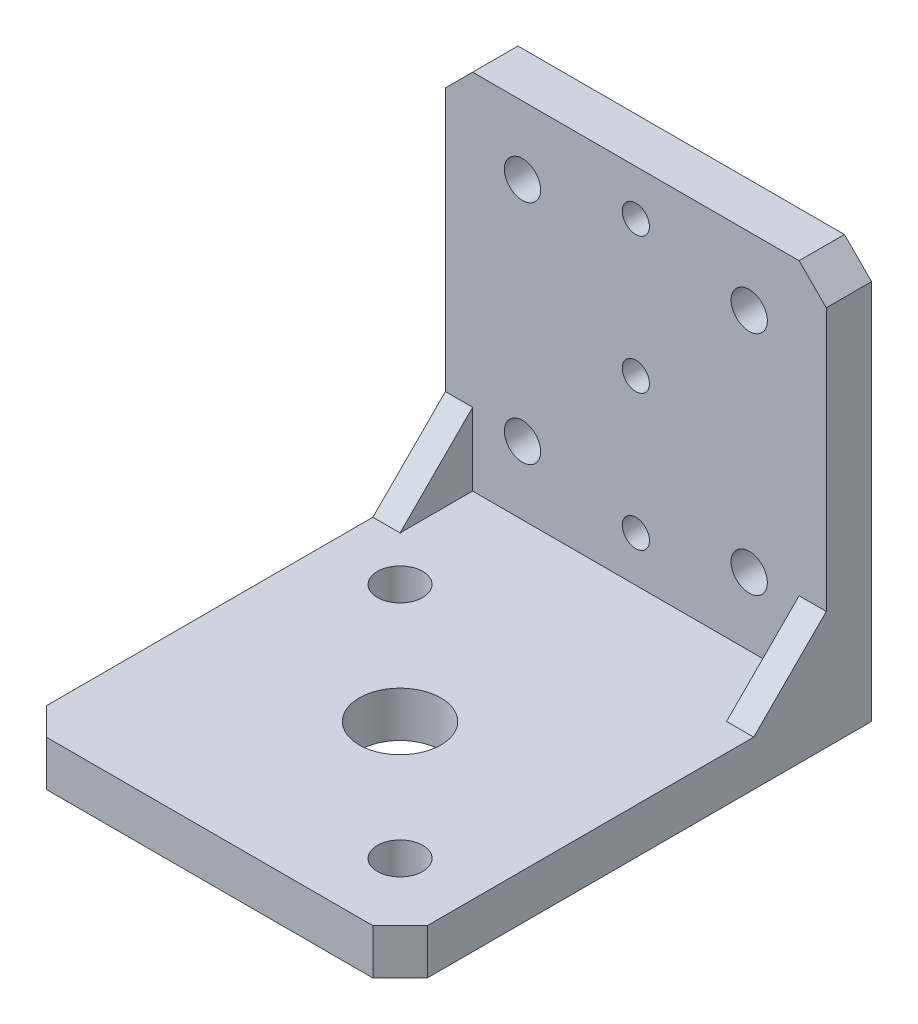
ISO-10303-21;
HEADER;
FILE_DESCRIPTION(('STEP AP214'),'2;1');
FILE_NAME('part.step','',(''),(''),'','','');
FILE_SCHEMA(('AUTOMOTIVE_DESIGN { 1 0 10303 214 1 1 1 1 }'));
ENDSEC;
DATA;
#1=APPLICATION_CONTEXT('core data for automotive mechanical design processes');
#2=APPLICATION_PROTOCOL_DEFINITION('international standard','automotive_design',2000,#1);
#3=PRODUCT_CONTEXT('',#1,'mechanical');
#4=PRODUCT('Part','Part','',(#3));
#5=PRODUCT_RELATED_PRODUCT_CATEGORY('part','',(#4));
#6=PRODUCT_DEFINITION_FORMATION('','',#4);
#7=PRODUCT_DEFINITION_CONTEXT('part definition',#1,'design');
#8=PRODUCT_DEFINITION('design','',#6,#7);
#9=PRODUCT_DEFINITION_SHAPE('','',#8);
#10=(LENGTH_UNIT() NAMED_UNIT(*) SI_UNIT(.MILLI.,.METRE.));
#11=(NAMED_UNIT(*) PLANE_ANGLE_UNIT() SI_UNIT($,.RADIAN.));
#12=(NAMED_UNIT(*) SI_UNIT($,.STERADIAN.) SOLID_ANGLE_UNIT());
#13=UNCERTAINTY_MEASURE_WITH_UNIT(LENGTH_MEASURE(1.E-05),#10,'distance_accuracy_value','');
#14=(GEOMETRIC_REPRESENTATION_CONTEXT(3) GLOBAL_UNCERTAINTY_ASSIGNED_CONTEXT((#13)) GLOBAL_UNIT_ASSIGNED_CONTEXT((#10,
#11,#12)) REPRESENTATION_CONTEXT('',''));
#15=CARTESIAN_POINT('',(0.,0.,0.));
#16=DIRECTION('',(0.,0.,1.));
#17=DIRECTION('',(1.,0.,0.));
#18=AXIS2_PLACEMENT_3D('',#15,#16,#17);
#19=CARTESIAN_POINT('',(21.,5.,23.5));
#20=DIRECTION('',(-1.,0.,0.));
#21=DIRECTION('',(0.,0.,1.));
#22=AXIS2_PLACEMENT_3D('',#19,#20,#21);
#23=PLANE('',#22);
#24=DIRECTION('',(0.,0.,-1.));
#25=VECTOR('',#24,1.);
#26=CARTESIAN_POINT('',(21.,5.,23.5));
#27=LINE('',#26,#25);
#28=CARTESIAN_POINT('',(21.,5.,20.5));
#29=VERTEX_POINT('',#28);
#30=CARTESIAN_POINT('',(21.,5.,-15.5));
#31=VERTEX_POINT('',#30);
#32=EDGE_CURVE('E163',#29,#31,#27,.T.);
#33=ORIENTED_EDGE('',*,*,#32,.F.);
#34=DIRECTION('',(0.,-1.,0.));
#35=VECTOR('',#34,1.);
#36=CARTESIAN_POINT('',(21.,5.,20.5));
#37=LINE('',#36,#35);
#38=CARTESIAN_POINT('',(21.,0.,20.5));
#39=VERTEX_POINT('',#38);
#40=EDGE_CURVE('E334',#29,#39,#37,.T.);
#41=ORIENTED_EDGE('',*,*,#40,.T.);
#42=DIRECTION('',(0.,0.,-1.));
#43=VECTOR('',#42,1.);
#44=CARTESIAN_POINT('',(21.,0.,23.5));
#45=LINE('',#44,#43);
#46=CARTESIAN_POINT('',(21.,0.,-28.5));
#47=VERTEX_POINT('',#46);
#48=EDGE_CURVE('E183',#39,#47,#45,.T.);
#49=ORIENTED_EDGE('',*,*,#48,.T.);
#50=DIRECTION('',(0.,-1.,0.));
#51=VECTOR('',#50,1.);
#52=CARTESIAN_POINT('',(21.,0.,-28.5));
#53=LINE('',#52,#51);
#54=CARTESIAN_POINT('',(21.,42.,-28.5));
#55=VERTEX_POINT('',#54);
#56=EDGE_CURVE('E224',#55,#47,#53,.T.);
#57=ORIENTED_EDGE('',*,*,#56,.F.);
#58=DIRECTION('',(0.,0.,1.));
#59=VECTOR('',#58,1.);
#60=CARTESIAN_POINT('',(21.,42.,23.5));
#61=LINE('',#60,#59);
#62=CARTESIAN_POINT('',(21.,42.,-23.5));
#63=VERTEX_POINT('',#62);
#64=EDGE_CURVE('E209',#55,#63,#61,.T.);
#65=ORIENTED_EDGE('',*,*,#64,.T.);
#66=DIRECTION('',(0.,-1.,0.));
#67=VECTOR('',#66,1.);
#68=CARTESIAN_POINT('',(21.,0.,-23.5));
#69=LINE('',#68,#67);
#70=CARTESIAN_POINT('',(21.,13.,-23.5));
#71=VERTEX_POINT('',#70);
#72=EDGE_CURVE('E210',#63,#71,#69,.T.);
#73=ORIENTED_EDGE('',*,*,#72,.T.);
#74=DIRECTION('',(0.,-0.707106781186547,0.707106781186548));
#75=VECTOR('',#74,1.);
#76=CARTESIAN_POINT('',(21.,13.,-23.5));
#77=LINE('',#76,#75);
#78=EDGE_CURVE('E231',#71,#31,#77,.T.);
#79=ORIENTED_EDGE('',*,*,#78,.T.);
#80=EDGE_LOOP('',(#33,#41,#49,#57,#65,#73,#79));
#81=FACE_BOUND('',#80,.T.);
#82=ADVANCED_FACE('F33',(#81),#23,.F.);
#83=CARTESIAN_POINT('',(-21.,5.,23.5));
#84=DIRECTION('',(1.,0.,0.));
#85=DIRECTION('',(0.,0.,-1.));
#86=AXIS2_PLACEMENT_3D('',#83,#84,#85);
#87=PLANE('',#86);
#88=DIRECTION('',(0.,0.,1.));
#89=VECTOR('',#88,1.);
#90=CARTESIAN_POINT('',(-21.,0.,23.5));
#91=LINE('',#90,#89);
#92=CARTESIAN_POINT('',(-21.,0.,-28.5));
#93=VERTEX_POINT('',#92);
#94=CARTESIAN_POINT('',(-21.,0.,20.5));
#95=VERTEX_POINT('',#94);
#96=EDGE_CURVE('E186',#93,#95,#91,.T.);
#97=ORIENTED_EDGE('',*,*,#96,.T.);
#98=DIRECTION('',(0.,1.,0.));
#99=VECTOR('',#98,1.);
#100=CARTESIAN_POINT('',(-21.,5.,20.5));
#101=LINE('',#100,#99);
#102=CARTESIAN_POINT('',(-21.,5.,20.5));
#103=VERTEX_POINT('',#102);
#104=EDGE_CURVE('E203',#95,#103,#101,.T.);
#105=ORIENTED_EDGE('',*,*,#104,.T.);
#106=DIRECTION('',(0.,0.,1.));
#107=VECTOR('',#106,1.);
#108=CARTESIAN_POINT('',(-21.,5.,23.5));
#109=LINE('',#108,#107);
#110=CARTESIAN_POINT('',(-21.,5.,-15.5));
#111=VERTEX_POINT('',#110);
#112=EDGE_CURVE('E162',#111,#103,#109,.T.);
#113=ORIENTED_EDGE('',*,*,#112,.F.);
#114=DIRECTION('',(0.,0.707106781186548,-0.707106781186548));
#115=VECTOR('',#114,1.);
#116=CARTESIAN_POINT('',(-21.,13.,-23.5));
#117=LINE('',#116,#115);
#118=CARTESIAN_POINT('',(-21.,13.,-23.5));
#119=VERTEX_POINT('',#118);
#120=EDGE_CURVE('E154',#111,#119,#117,.T.);
#121=ORIENTED_EDGE('',*,*,#120,.T.);
#122=DIRECTION('',(0.,1.,0.));
#123=VECTOR('',#122,1.);
#124=CARTESIAN_POINT('',(-21.,0.,-23.5));
#125=LINE('',#124,#123);
#126=CARTESIAN_POINT('',(-21.,42.,-23.5));
#127=VERTEX_POINT('',#126);
#128=EDGE_CURVE('E174',#119,#127,#125,.T.);
#129=ORIENTED_EDGE('',*,*,#128,.T.);
#130=DIRECTION('',(0.,0.,-1.));
#131=VECTOR('',#130,1.);
#132=CARTESIAN_POINT('',(-21.,42.,23.5));
#133=LINE('',#132,#131);
#134=CARTESIAN_POINT('',(-21.,42.,-28.5));
#135=VERTEX_POINT('',#134);
#136=EDGE_CURVE('E201',#127,#135,#133,.T.);
#137=ORIENTED_EDGE('',*,*,#136,.T.);
#138=DIRECTION('',(0.,1.,0.));
#139=VECTOR('',#138,1.);
#140=CARTESIAN_POINT('',(-21.,0.,-28.5));
#141=LINE('',#140,#139);
#142=EDGE_CURVE('E219',#93,#135,#141,.T.);
#143=ORIENTED_EDGE('',*,*,#142,.F.);
#144=EDGE_LOOP('',(#97,#105,#113,#121,#129,#137,#143));
#145=FACE_BOUND('',#144,.T.);
#146=ADVANCED_FACE('F350',(#145),#87,.F.);
#147=CARTESIAN_POINT('',(-21.,5.,23.5));
#148=DIRECTION('',(0.,0.,-1.));
#149=DIRECTION('',(-1.,0.,0.));
#150=AXIS2_PLACEMENT_3D('',#147,#148,#149);
#151=PLANE('',#150);
#152=DIRECTION('',(1.,0.,0.));
#153=VECTOR('',#152,1.);
#154=CARTESIAN_POINT('',(-21.,5.,23.5));
#155=LINE('',#154,#153);
#156=CARTESIAN_POINT('',(-18.,5.,23.5));
#157=VERTEX_POINT('',#156);
#158=CARTESIAN_POINT('',(18.,5.,23.5));
#159=VERTEX_POINT('',#158);
#160=EDGE_CURVE('E165',#157,#159,#155,.T.);
#161=ORIENTED_EDGE('',*,*,#160,.F.);
#162=DIRECTION('',(0.,-1.,0.));
#163=VECTOR('',#162,1.);
#164=CARTESIAN_POINT('',(-18.,5.,23.5));
#165=LINE('',#164,#163);
#166=CARTESIAN_POINT('',(-18.,0.,23.5));
#167=VERTEX_POINT('',#166);
#168=EDGE_CURVE('E194',#157,#167,#165,.T.);
#169=ORIENTED_EDGE('',*,*,#168,.T.);
#170=DIRECTION('',(1.,0.,0.));
#171=VECTOR('',#170,1.);
#172=CARTESIAN_POINT('',(-21.,0.,23.5));
#173=LINE('',#172,#171);
#174=CARTESIAN_POINT('',(18.,0.,23.5));
#175=VERTEX_POINT('',#174);
#176=EDGE_CURVE('E167',#167,#175,#173,.T.);
#177=ORIENTED_EDGE('',*,*,#176,.T.);
#178=DIRECTION('',(0.,1.,0.));
#179=VECTOR('',#178,1.);
#180=CARTESIAN_POINT('',(18.,5.,23.5));
#181=LINE('',#180,#179);
#182=EDGE_CURVE('E182',#175,#159,#181,.T.);
#183=ORIENTED_EDGE('',*,*,#182,.T.);
#184=EDGE_LOOP('',(#161,#169,#177,#183));
#185=FACE_BOUND('',#184,.T.);
#186=ADVANCED_FACE('F368',(#185),#151,.F.);
#187=CARTESIAN_POINT('',(0.,5.,0.));
#188=DIRECTION('',(0.,-1.,0.));
#189=DIRECTION('',(0.,0.,-1.));
#190=AXIS2_PLACEMENT_3D('',#187,#188,#189);
#191=PLANE('',#190);
#192=CARTESIAN_POINT('',(0.,5.,2.49999999999999));
#193=DIRECTION('',(0.,1.,0.));
#194=DIRECTION('',(0.,0.,1.));
#195=AXIS2_PLACEMENT_3D('',#192,#193,#194);
#196=CIRCLE('',#195,4.5);
#197=CARTESIAN_POINT('',(0.,5.,6.99999999999999));
#198=VERTEX_POINT('',#197);
#199=EDGE_CURVE('E257',#198,#198,#196,.T.);
#200=ORIENTED_EDGE('',*,*,#199,.F.);
#201=EDGE_LOOP('',(#200));
#202=FACE_BOUND('',#201,.T.);
#203=CARTESIAN_POINT('',(13.0814754519512,5.,15.5814754519511));
#204=DIRECTION('',(0.,1.,0.));
#205=DIRECTION('',(0.,0.,1.));
#206=AXIS2_PLACEMENT_3D('',#203,#204,#205);
#207=CIRCLE('',#206,2.5);
#208=CARTESIAN_POINT('',(13.0814754519512,5.,18.0814754519511));
#209=VERTEX_POINT('',#208);
#210=EDGE_CURVE('E251',#209,#209,#207,.T.);
#211=ORIENTED_EDGE('',*,*,#210,.F.);
#212=EDGE_LOOP('',(#211));
#213=FACE_BOUND('',#212,.T.);
#214=CARTESIAN_POINT('',(-13.0814754519512,5.,-10.5814754519511));
#215=DIRECTION('',(0.,1.,0.));
#216=DIRECTION('',(0.,0.,1.));
#217=AXIS2_PLACEMENT_3D('',#214,#215,#216);
#218=CIRCLE('',#217,2.5);
#219=CARTESIAN_POINT('',(-13.0814754519512,5.,-8.08147545195111));
#220=VERTEX_POINT('',#219);
#221=EDGE_CURVE('E245',#220,#220,#218,.T.);
#222=ORIENTED_EDGE('',*,*,#221,.F.);
#223=EDGE_LOOP('',(#222));
#224=FACE_BOUND('',#223,.T.);
#225=ORIENTED_EDGE('',*,*,#112,.T.);
#226=DIRECTION('',(-0.707106781186548,0.,-0.707106781186548));
#227=VECTOR('',#226,1.);
#228=CARTESIAN_POINT('',(-18.,5.,23.5));
#229=LINE('',#228,#227);
#230=EDGE_CURVE('E207',#103,#157,#229,.F.);
#231=ORIENTED_EDGE('',*,*,#230,.T.);
#232=ORIENTED_EDGE('',*,*,#160,.T.);
#233=DIRECTION('',(-0.707106781186548,0.,0.707106781186548));
#234=VECTOR('',#233,1.);
#235=CARTESIAN_POINT('',(21.,5.,20.5));
#236=LINE('',#235,#234);
#237=EDGE_CURVE('E204',#159,#29,#236,.F.);
#238=ORIENTED_EDGE('',*,*,#237,.T.);
#239=ORIENTED_EDGE('',*,*,#32,.T.);
#240=DIRECTION('',(1.,0.,0.));
#241=VECTOR('',#240,1.);
#242=CARTESIAN_POINT('',(18.,5.,-15.5));
#243=LINE('',#242,#241);
#244=CARTESIAN_POINT('',(18.,5.,-15.5));
#245=VERTEX_POINT('',#244);
#246=EDGE_CURVE('E213',#245,#31,#243,.T.);
#247=ORIENTED_EDGE('',*,*,#246,.F.);
#248=DIRECTION('',(0.,0.,-1.));
#249=VECTOR('',#248,1.);
#250=CARTESIAN_POINT('',(18.,5.,-15.5));
#251=LINE('',#250,#249);
#252=CARTESIAN_POINT('',(18.,5.,-23.5));
#253=VERTEX_POINT('',#252);
#254=EDGE_CURVE('E161',#245,#253,#251,.T.);
#255=ORIENTED_EDGE('',*,*,#254,.T.);
#256=DIRECTION('',(-1.,0.,0.));
#257=VECTOR('',#256,1.);
#258=CARTESIAN_POINT('',(-21.,5.,-23.5));
#259=LINE('',#258,#257);
#260=CARTESIAN_POINT('',(-18.,5.,-23.5));
#261=VERTEX_POINT('',#260);
#262=EDGE_CURVE('E150',#253,#261,#259,.T.);
#263=ORIENTED_EDGE('',*,*,#262,.T.);
#264=DIRECTION('',(0.,0.,1.));
#265=VECTOR('',#264,1.);
#266=CARTESIAN_POINT('',(-18.,5.,-15.5));
#267=LINE('',#266,#265);
#268=CARTESIAN_POINT('',(-18.,5.,-15.5));
#269=VERTEX_POINT('',#268);
#270=EDGE_CURVE('E134',#261,#269,#267,.T.);
#271=ORIENTED_EDGE('',*,*,#270,.T.);
#272=DIRECTION('',(-1.,0.,0.));
#273=VECTOR('',#272,1.);
#274=CARTESIAN_POINT('',(-18.,5.,-15.5));
#275=LINE('',#274,#273);
#276=EDGE_CURVE('E239',#269,#111,#275,.T.);
#277=ORIENTED_EDGE('',*,*,#276,.T.);
#278=EDGE_LOOP('',(#225,#231,#232,#238,#239,#247,#255,#263,#271,#277));
#279=FACE_BOUND('',#278,.T.);
#280=ADVANCED_FACE('F158',(#202,#213,#224,#279),#191,.F.);
#281=CARTESIAN_POINT('',(0.,0.,0.));
#282=DIRECTION('',(0.,-1.,0.));
#283=DIRECTION('',(0.,0.,-1.));
#284=AXIS2_PLACEMENT_3D('',#281,#282,#283);
#285=PLANE('',#284);
#286=CARTESIAN_POINT('',(0.,0.,2.49999999999999));
#287=DIRECTION('',(0.,1.,0.));
#288=DIRECTION('',(0.,0.,1.));
#289=AXIS2_PLACEMENT_3D('',#286,#287,#288);
#290=CIRCLE('',#289,4.5);
#291=CARTESIAN_POINT('',(0.,0.,6.99999999999999));
#292=VERTEX_POINT('',#291);
#293=EDGE_CURVE('E254',#292,#292,#290,.T.);
#294=ORIENTED_EDGE('',*,*,#293,.T.);
#295=EDGE_LOOP('',(#294));
#296=FACE_BOUND('',#295,.T.);
#297=CARTESIAN_POINT('',(13.0814754519512,0.,15.5814754519511));
#298=DIRECTION('',(0.,1.,0.));
#299=DIRECTION('',(0.,0.,1.));
#300=AXIS2_PLACEMENT_3D('',#297,#298,#299);
#301=CIRCLE('',#300,2.5);
#302=CARTESIAN_POINT('',(13.0814754519512,0.,18.0814754519511));
#303=VERTEX_POINT('',#302);
#304=EDGE_CURVE('E248',#303,#303,#301,.T.);
#305=ORIENTED_EDGE('',*,*,#304,.T.);
#306=EDGE_LOOP('',(#305));
#307=FACE_BOUND('',#306,.T.);
#308=CARTESIAN_POINT('',(-13.0814754519512,0.,-10.5814754519511));
#309=DIRECTION('',(0.,1.,0.));
#310=DIRECTION('',(0.,0.,1.));
#311=AXIS2_PLACEMENT_3D('',#308,#309,#310);
#312=CIRCLE('',#311,2.5);
#313=CARTESIAN_POINT('',(-13.0814754519512,0.,-8.08147545195111));
#314=VERTEX_POINT('',#313);
#315=EDGE_CURVE('E243',#314,#314,#312,.T.);
#316=ORIENTED_EDGE('',*,*,#315,.T.);
#317=EDGE_LOOP('',(#316));
#318=FACE_BOUND('',#317,.T.);
#319=ORIENTED_EDGE('',*,*,#176,.F.);
#320=DIRECTION('',(0.707106781186548,0.,0.707106781186548));
#321=VECTOR('',#320,1.);
#322=CARTESIAN_POINT('',(-20.75,0.,20.75));
#323=LINE('',#322,#321);
#324=EDGE_CURVE('E199',#167,#95,#323,.F.);
#325=ORIENTED_EDGE('',*,*,#324,.T.);
#326=ORIENTED_EDGE('',*,*,#96,.F.);
#327=DIRECTION('',(-1.,0.,0.));
#328=VECTOR('',#327,1.);
#329=CARTESIAN_POINT('',(21.,0.,-28.5));
#330=LINE('',#329,#328);
#331=EDGE_CURVE('E221',#47,#93,#330,.T.);
#332=ORIENTED_EDGE('',*,*,#331,.F.);
#333=ORIENTED_EDGE('',*,*,#48,.F.);
#334=DIRECTION('',(0.707106781186548,0.,-0.707106781186548));
#335=VECTOR('',#334,1.);
#336=CARTESIAN_POINT('',(20.75,0.,20.75));
#337=LINE('',#336,#335);
#338=EDGE_CURVE('E197',#39,#175,#337,.F.);
#339=ORIENTED_EDGE('',*,*,#338,.T.);
#340=EDGE_LOOP('',(#319,#325,#326,#332,#333,#339));
#341=FACE_BOUND('',#340,.T.);
#342=ADVANCED_FACE('F403',(#296,#307,#318,#341),#285,.T.);
#343=CARTESIAN_POINT('',(0.,0.,-23.5));
#344=DIRECTION('',(0.,0.,1.));
#345=DIRECTION('',(1.,0.,0.));
#346=AXIS2_PLACEMENT_3D('',#343,#344,#345);
#347=PLANE('',#346);
#348=CARTESIAN_POINT('',(9.12464548363801E-13,40.0000000000001,-23.5));
#349=DIRECTION('',(0.,0.,1.));
#350=DIRECTION('',(1.,0.,0.));
#351=AXIS2_PLACEMENT_3D('',#348,#349,#350);
#352=CIRCLE('',#351,1.5);
#353=CARTESIAN_POINT('',(1.50000000000091,40.0000000000001,-23.5));
#354=VERTEX_POINT('',#353);
#355=EDGE_CURVE('E299',#354,#354,#352,.F.);
#356=ORIENTED_EDGE('',*,*,#355,.T.);
#357=EDGE_LOOP('',(#356));
#358=FACE_BOUND('',#357,.T.);
#359=CARTESIAN_POINT('',(1.22471477403963E-12,10.0000000000001,-23.5));
#360=DIRECTION('',(0.,0.,1.));
#361=DIRECTION('',(1.,0.,0.));
#362=AXIS2_PLACEMENT_3D('',#359,#360,#361);
#363=CIRCLE('',#362,1.50000000000062);
#364=CARTESIAN_POINT('',(1.50000000000184,10.0000000000001,-23.5));
#365=VERTEX_POINT('',#364);
#366=EDGE_CURVE('E293',#365,#365,#363,.F.);
#367=ORIENTED_EDGE('',*,*,#366,.T.);
#368=EDGE_LOOP('',(#367));
#369=FACE_BOUND('',#368,.T.);
#370=CARTESIAN_POINT('',(1.06858966120171E-12,25.0000000000001,-23.5));
#371=DIRECTION('',(0.,0.,1.));
#372=DIRECTION('',(1.,0.,0.));
#373=AXIS2_PLACEMENT_3D('',#370,#371,#372);
#374=CIRCLE('',#373,1.5);
#375=CARTESIAN_POINT('',(1.50000000000107,25.0000000000001,-23.5));
#376=VERTEX_POINT('',#375);
#377=EDGE_CURVE('E287',#376,#376,#374,.F.);
#378=ORIENTED_EDGE('',*,*,#377,.T.);
#379=EDGE_LOOP('',(#378));
#380=FACE_BOUND('',#379,.T.);
#381=CARTESIAN_POINT('',(-12.5,12.5,-23.5));
#382=DIRECTION('',(0.,0.,1.));
#383=DIRECTION('',(1.,0.,0.));
#384=AXIS2_PLACEMENT_3D('',#381,#382,#383);
#385=CIRCLE('',#384,2.);
#386=CARTESIAN_POINT('',(-10.5,12.5,-23.5));
#387=VERTEX_POINT('',#386);
#388=EDGE_CURVE('E281',#387,#387,#385,.T.);
#389=ORIENTED_EDGE('',*,*,#388,.F.);
#390=EDGE_LOOP('',(#389));
#391=FACE_BOUND('',#390,.T.);
#392=CARTESIAN_POINT('',(12.5,12.5,-23.5));
#393=DIRECTION('',(0.,0.,1.));
#394=DIRECTION('',(1.,0.,0.));
#395=AXIS2_PLACEMENT_3D('',#392,#393,#394);
#396=CIRCLE('',#395,2.);
#397=CARTESIAN_POINT('',(14.5,12.5,-23.5));
#398=VERTEX_POINT('',#397);
#399=EDGE_CURVE('E275',#398,#398,#396,.T.);
#400=ORIENTED_EDGE('',*,*,#399,.F.);
#401=EDGE_LOOP('',(#400));
#402=FACE_BOUND('',#401,.T.);
#403=CARTESIAN_POINT('',(12.5,37.5,-23.5));
#404=DIRECTION('',(0.,0.,1.));
#405=DIRECTION('',(1.,0.,0.));
#406=AXIS2_PLACEMENT_3D('',#403,#404,#405);
#407=CIRCLE('',#406,2.);
#408=CARTESIAN_POINT('',(14.5,37.5,-23.5));
#409=VERTEX_POINT('',#408);
#410=EDGE_CURVE('E269',#409,#409,#407,.T.);
#411=ORIENTED_EDGE('',*,*,#410,.F.);
#412=EDGE_LOOP('',(#411));
#413=FACE_BOUND('',#412,.T.);
#414=CARTESIAN_POINT('',(-12.5,37.5,-23.5));
#415=DIRECTION('',(0.,0.,1.));
#416=DIRECTION('',(1.,0.,0.));
#417=AXIS2_PLACEMENT_3D('',#414,#415,#416);
#418=CIRCLE('',#417,2.);
#419=CARTESIAN_POINT('',(-10.5,37.5,-23.5));
#420=VERTEX_POINT('',#419);
#421=EDGE_CURVE('E263',#420,#420,#418,.T.);
#422=ORIENTED_EDGE('',*,*,#421,.F.);
#423=EDGE_LOOP('',(#422));
#424=FACE_BOUND('',#423,.T.);
#425=ORIENTED_EDGE('',*,*,#72,.F.);
#426=DIRECTION('',(0.70710678118655,-0.707106781186545,0.));
#427=VECTOR('',#426,1.);
#428=CARTESIAN_POINT('',(31.4999999999999,31.5000000000001,-23.5));
#429=LINE('',#428,#427);
#430=CARTESIAN_POINT('',(18.,45.,-23.5));
#431=VERTEX_POINT('',#430);
#432=EDGE_CURVE('E332',#63,#431,#429,.F.);
#433=ORIENTED_EDGE('',*,*,#432,.T.);
#434=DIRECTION('',(1.,0.,0.));
#435=VECTOR('',#434,1.);
#436=CARTESIAN_POINT('',(21.,45.,-23.5));
#437=LINE('',#436,#435);
#438=CARTESIAN_POINT('',(-18.,45.,-23.5));
#439=VERTEX_POINT('',#438);
#440=EDGE_CURVE('E179',#439,#431,#437,.T.);
#441=ORIENTED_EDGE('',*,*,#440,.F.);
#442=DIRECTION('',(0.707106781186547,0.707106781186548,0.));
#443=VECTOR('',#442,1.);
#444=CARTESIAN_POINT('',(-31.5,31.5,-23.5));
#445=LINE('',#444,#443);
#446=EDGE_CURVE('E336',#439,#127,#445,.F.);
#447=ORIENTED_EDGE('',*,*,#446,.T.);
#448=ORIENTED_EDGE('',*,*,#128,.F.);
#449=DIRECTION('',(-1.,0.,0.));
#450=VECTOR('',#449,1.);
#451=CARTESIAN_POINT('',(-18.,13.,-23.5));
#452=LINE('',#451,#450);
#453=CARTESIAN_POINT('',(-18.,13.,-23.5));
#454=VERTEX_POINT('',#453);
#455=EDGE_CURVE('E153',#454,#119,#452,.T.);
#456=ORIENTED_EDGE('',*,*,#455,.F.);
#457=DIRECTION('',(0.,-1.,0.));
#458=VECTOR('',#457,1.);
#459=CARTESIAN_POINT('',(-18.,5.,-23.5));
#460=LINE('',#459,#458);
#461=EDGE_CURVE('E137',#454,#261,#460,.T.);
#462=ORIENTED_EDGE('',*,*,#461,.T.);
#463=ORIENTED_EDGE('',*,*,#262,.F.);
#464=DIRECTION('',(0.,1.,0.));
#465=VECTOR('',#464,1.);
#466=CARTESIAN_POINT('',(18.,5.,-23.5));
#467=LINE('',#466,#465);
#468=CARTESIAN_POINT('',(18.,13.,-23.5));
#469=VERTEX_POINT('',#468);
#470=EDGE_CURVE('E234',#253,#469,#467,.T.);
#471=ORIENTED_EDGE('',*,*,#470,.T.);
#472=DIRECTION('',(1.,0.,0.));
#473=VECTOR('',#472,1.);
#474=CARTESIAN_POINT('',(18.,13.,-23.5));
#475=LINE('',#474,#473);
#476=EDGE_CURVE('E226',#469,#71,#475,.T.);
#477=ORIENTED_EDGE('',*,*,#476,.T.);
#478=EDGE_LOOP('',(#425,#433,#441,#447,#448,#456,#462,#463,#471,#477));
#479=FACE_BOUND('',#478,.T.);
#480=ADVANCED_FACE('F148',(#358,#369,#380,#391,#402,#413,#424,#479),#347,.T.);
#481=CARTESIAN_POINT('',(21.,45.,-28.5));
#482=DIRECTION('',(0.,-1.,0.));
#483=DIRECTION('',(0.,0.,-1.));
#484=AXIS2_PLACEMENT_3D('',#481,#482,#483);
#485=PLANE('',#484);
#486=ORIENTED_EDGE('',*,*,#440,.T.);
#487=DIRECTION('',(0.,0.,-1.));
#488=VECTOR('',#487,1.);
#489=CARTESIAN_POINT('',(18.,45.,-28.5));
#490=LINE('',#489,#488);
#491=CARTESIAN_POINT('',(18.,45.,-28.5));
#492=VERTEX_POINT('',#491);
#493=EDGE_CURVE('E48',#431,#492,#490,.T.);
#494=ORIENTED_EDGE('',*,*,#493,.T.);
#495=DIRECTION('',(1.,0.,0.));
#496=VECTOR('',#495,1.);
#497=CARTESIAN_POINT('',(21.,45.,-28.5));
#498=LINE('',#497,#496);
#499=CARTESIAN_POINT('',(-18.,45.,-28.5));
#500=VERTEX_POINT('',#499);
#501=EDGE_CURVE('E187',#500,#492,#498,.T.);
#502=ORIENTED_EDGE('',*,*,#501,.F.);
#503=DIRECTION('',(0.,0.,1.));
#504=VECTOR('',#503,1.);
#505=CARTESIAN_POINT('',(-18.,45.,-28.5));
#506=LINE('',#505,#504);
#507=EDGE_CURVE('E343',#500,#439,#506,.T.);
#508=ORIENTED_EDGE('',*,*,#507,.T.);
#509=EDGE_LOOP('',(#486,#494,#502,#508));
#510=FACE_BOUND('',#509,.T.);
#511=ADVANCED_FACE('F311',(#510),#485,.F.);
#512=CARTESIAN_POINT('',(0.,0.,-28.5));
#513=DIRECTION('',(0.,0.,1.));
#514=DIRECTION('',(1.,0.,0.));
#515=AXIS2_PLACEMENT_3D('',#512,#513,#514);
#516=PLANE('',#515);
#517=CARTESIAN_POINT('',(9.12464548363801E-13,40.0000000000001,-28.5));
#518=DIRECTION('',(0.,0.,-1.));
#519=DIRECTION('',(-1.,0.,0.));
#520=AXIS2_PLACEMENT_3D('',#517,#518,#519);
#521=CIRCLE('',#520,1.5);
#522=CARTESIAN_POINT('',(-1.49999999999909,40.0000000000001,-28.5));
#523=VERTEX_POINT('',#522);
#524=EDGE_CURVE('E296',#523,#523,#521,.T.);
#525=ORIENTED_EDGE('',*,*,#524,.F.);
#526=EDGE_LOOP('',(#525));
#527=FACE_BOUND('',#526,.T.);
#528=CARTESIAN_POINT('',(1.22471477403963E-12,10.0000000000001,-28.5));
#529=DIRECTION('',(0.,0.,-1.));
#530=DIRECTION('',(-1.,0.,0.));
#531=AXIS2_PLACEMENT_3D('',#528,#529,#530);
#532=CIRCLE('',#531,1.50000000000062);
#533=CARTESIAN_POINT('',(-1.49999999999939,10.0000000000001,-28.5));
#534=VERTEX_POINT('',#533);
#535=EDGE_CURVE('E290',#534,#534,#532,.T.);
#536=ORIENTED_EDGE('',*,*,#535,.F.);
#537=EDGE_LOOP('',(#536));
#538=FACE_BOUND('',#537,.T.);
#539=CARTESIAN_POINT('',(1.06858966120171E-12,25.0000000000001,-28.5));
#540=DIRECTION('',(0.,0.,-1.));
#541=DIRECTION('',(-1.,0.,0.));
#542=AXIS2_PLACEMENT_3D('',#539,#540,#541);
#543=CIRCLE('',#542,1.5);
#544=CARTESIAN_POINT('',(-1.49999999999893,25.0000000000001,-28.5));
#545=VERTEX_POINT('',#544);
#546=EDGE_CURVE('E284',#545,#545,#543,.T.);
#547=ORIENTED_EDGE('',*,*,#546,.F.);
#548=EDGE_LOOP('',(#547));
#549=FACE_BOUND('',#548,.T.);
#550=CARTESIAN_POINT('',(-12.5,12.5,-28.5));
#551=DIRECTION('',(0.,0.,1.));
#552=DIRECTION('',(1.,0.,0.));
#553=AXIS2_PLACEMENT_3D('',#550,#551,#552);
#554=CIRCLE('',#553,2.);
#555=CARTESIAN_POINT('',(-10.5,12.5,-28.5));
#556=VERTEX_POINT('',#555);
#557=EDGE_CURVE('E278',#556,#556,#554,.T.);
#558=ORIENTED_EDGE('',*,*,#557,.T.);
#559=EDGE_LOOP('',(#558));
#560=FACE_BOUND('',#559,.T.);
#561=CARTESIAN_POINT('',(12.5,12.5,-28.5));
#562=DIRECTION('',(0.,0.,1.));
#563=DIRECTION('',(1.,0.,0.));
#564=AXIS2_PLACEMENT_3D('',#561,#562,#563);
#565=CIRCLE('',#564,2.);
#566=CARTESIAN_POINT('',(14.5,12.5,-28.5));
#567=VERTEX_POINT('',#566);
#568=EDGE_CURVE('E272',#567,#567,#565,.T.);
#569=ORIENTED_EDGE('',*,*,#568,.T.);
#570=EDGE_LOOP('',(#569));
#571=FACE_BOUND('',#570,.T.);
#572=CARTESIAN_POINT('',(12.5,37.5,-28.5));
#573=DIRECTION('',(0.,0.,1.));
#574=DIRECTION('',(1.,0.,0.));
#575=AXIS2_PLACEMENT_3D('',#572,#573,#574);
#576=CIRCLE('',#575,2.);
#577=CARTESIAN_POINT('',(14.5,37.5,-28.5));
#578=VERTEX_POINT('',#577);
#579=EDGE_CURVE('E266',#578,#578,#576,.T.);
#580=ORIENTED_EDGE('',*,*,#579,.T.);
#581=EDGE_LOOP('',(#580));
#582=FACE_BOUND('',#581,.T.);
#583=CARTESIAN_POINT('',(-12.5,37.5,-28.5));
#584=DIRECTION('',(0.,0.,1.));
#585=DIRECTION('',(1.,0.,0.));
#586=AXIS2_PLACEMENT_3D('',#583,#584,#585);
#587=CIRCLE('',#586,2.);
#588=CARTESIAN_POINT('',(-10.5,37.5,-28.5));
#589=VERTEX_POINT('',#588);
#590=EDGE_CURVE('E260',#589,#589,#587,.T.);
#591=ORIENTED_EDGE('',*,*,#590,.T.);
#592=EDGE_LOOP('',(#591));
#593=FACE_BOUND('',#592,.T.);
#594=ORIENTED_EDGE('',*,*,#501,.T.);
#595=DIRECTION('',(-0.70710678118655,0.707106781186545,0.));
#596=VECTOR('',#595,1.);
#597=CARTESIAN_POINT('',(21.,42.,-28.5));
#598=LINE('',#597,#596);
#599=EDGE_CURVE('E11',#492,#55,#598,.F.);
#600=ORIENTED_EDGE('',*,*,#599,.T.);
#601=ORIENTED_EDGE('',*,*,#56,.T.);
#602=ORIENTED_EDGE('',*,*,#331,.T.);
#603=ORIENTED_EDGE('',*,*,#142,.T.);
#604=DIRECTION('',(-0.707106781186547,-0.707106781186548,0.));
#605=VECTOR('',#604,1.);
#606=CARTESIAN_POINT('',(-18.,45.,-28.5));
#607=LINE('',#606,#605);
#608=EDGE_CURVE('E41',#135,#500,#607,.F.);
#609=ORIENTED_EDGE('',*,*,#608,.T.);
#610=EDGE_LOOP('',(#594,#600,#601,#602,#603,#609));
#611=FACE_BOUND('',#610,.T.);
#612=ADVANCED_FACE('F307',(#527,#538,#549,#560,#571,#582,#593,#611),#516,.F.);
#613=CARTESIAN_POINT('',(18.,13.,-23.5));
#614=DIRECTION('',(0.,0.707106781186548,0.707106781186547));
#615=DIRECTION('',(0.,-0.707106781186547,0.707106781186548));
#616=AXIS2_PLACEMENT_3D('',#613,#614,#615);
#617=PLANE('',#616);
#618=ORIENTED_EDGE('',*,*,#78,.F.);
#619=ORIENTED_EDGE('',*,*,#476,.F.);
#620=DIRECTION('',(0.,-0.707106781186547,0.707106781186548));
#621=VECTOR('',#620,1.);
#622=CARTESIAN_POINT('',(18.,13.,-23.5));
#623=LINE('',#622,#621);
#624=EDGE_CURVE('E236',#469,#245,#623,.T.);
#625=ORIENTED_EDGE('',*,*,#624,.T.);
#626=ORIENTED_EDGE('',*,*,#246,.T.);
#627=EDGE_LOOP('',(#618,#619,#625,#626));
#628=FACE_BOUND('',#627,.T.);
#629=ADVANCED_FACE('F310',(#628),#617,.T.);
#630=CARTESIAN_POINT('',(18.,0.,0.));
#631=DIRECTION('',(-1.,0.,0.));
#632=DIRECTION('',(0.,0.,1.));
#633=AXIS2_PLACEMENT_3D('',#630,#631,#632);
#634=PLANE('',#633);
#635=ORIENTED_EDGE('',*,*,#470,.F.);
#636=ORIENTED_EDGE('',*,*,#254,.F.);
#637=ORIENTED_EDGE('',*,*,#624,.F.);
#638=EDGE_LOOP('',(#635,#636,#637));
#639=FACE_BOUND('',#638,.T.);
#640=ADVANCED_FACE('F388',(#639),#634,.T.);
#641=CARTESIAN_POINT('',(-18.,13.,-23.5));
#642=DIRECTION('',(0.,0.707106781186547,0.707106781186547));
#643=DIRECTION('',(0.,-0.707106781186548,0.707106781186548));
#644=AXIS2_PLACEMENT_3D('',#641,#642,#643);
#645=PLANE('',#644);
#646=ORIENTED_EDGE('',*,*,#120,.F.);
#647=ORIENTED_EDGE('',*,*,#276,.F.);
#648=DIRECTION('',(0.,0.707106781186548,-0.707106781186548));
#649=VECTOR('',#648,1.);
#650=CARTESIAN_POINT('',(-18.,13.,-23.5));
#651=LINE('',#650,#649);
#652=EDGE_CURVE('E139',#269,#454,#651,.T.);
#653=ORIENTED_EDGE('',*,*,#652,.T.);
#654=ORIENTED_EDGE('',*,*,#455,.T.);
#655=EDGE_LOOP('',(#646,#647,#653,#654));
#656=FACE_BOUND('',#655,.T.);
#657=ADVANCED_FACE('F390',(#656),#645,.T.);
#658=CARTESIAN_POINT('',(-18.,0.,0.));
#659=DIRECTION('',(-1.,0.,0.));
#660=DIRECTION('',(0.,0.,1.));
#661=AXIS2_PLACEMENT_3D('',#658,#659,#660);
#662=PLANE('',#661);
#663=ORIENTED_EDGE('',*,*,#461,.F.);
#664=ORIENTED_EDGE('',*,*,#652,.F.);
#665=ORIENTED_EDGE('',*,*,#270,.F.);
#666=EDGE_LOOP('',(#663,#664,#665));
#667=FACE_BOUND('',#666,.T.);
#668=ADVANCED_FACE('F136',(#667),#662,.F.);
#669=CARTESIAN_POINT('',(-13.0814754519512,0.,-10.5814754519511));
#670=DIRECTION('',(0.,1.,0.));
#671=DIRECTION('',(0.,0.,1.));
#672=AXIS2_PLACEMENT_3D('',#669,#670,#671);
#673=CYLINDRICAL_SURFACE('',#672,2.5);
#674=ORIENTED_EDGE('',*,*,#315,.F.);
#675=EDGE_LOOP('',(#674));
#676=FACE_BOUND('',#675,.T.);
#677=ORIENTED_EDGE('',*,*,#221,.T.);
#678=EDGE_LOOP('',(#677));
#679=FACE_BOUND('',#678,.T.);
#680=ADVANCED_FACE('F475',(#676,#679),#673,.F.);
#681=CARTESIAN_POINT('',(13.0814754519512,0.,15.5814754519511));
#682=DIRECTION('',(0.,1.,0.));
#683=DIRECTION('',(0.,0.,1.));
#684=AXIS2_PLACEMENT_3D('',#681,#682,#683);
#685=CYLINDRICAL_SURFACE('',#684,2.5);
#686=ORIENTED_EDGE('',*,*,#304,.F.);
#687=EDGE_LOOP('',(#686));
#688=FACE_BOUND('',#687,.T.);
#689=ORIENTED_EDGE('',*,*,#210,.T.);
#690=EDGE_LOOP('',(#689));
#691=FACE_BOUND('',#690,.T.);
#692=ADVANCED_FACE('F483',(#688,#691),#685,.F.);
#693=CARTESIAN_POINT('',(0.,0.,2.49999999999999));
#694=DIRECTION('',(0.,1.,0.));
#695=DIRECTION('',(0.,0.,1.));
#696=AXIS2_PLACEMENT_3D('',#693,#694,#695);
#697=CYLINDRICAL_SURFACE('',#696,4.5);
#698=ORIENTED_EDGE('',*,*,#293,.F.);
#699=EDGE_LOOP('',(#698));
#700=FACE_BOUND('',#699,.T.);
#701=ORIENTED_EDGE('',*,*,#199,.T.);
#702=EDGE_LOOP('',(#701));
#703=FACE_BOUND('',#702,.T.);
#704=ADVANCED_FACE('F493',(#700,#703),#697,.F.);
#705=CARTESIAN_POINT('',(-12.5,37.5,-28.5));
#706=DIRECTION('',(0.,0.,1.));
#707=DIRECTION('',(1.,0.,0.));
#708=AXIS2_PLACEMENT_3D('',#705,#706,#707);
#709=CYLINDRICAL_SURFACE('',#708,2.);
#710=ORIENTED_EDGE('',*,*,#590,.F.);
#711=EDGE_LOOP('',(#710));
#712=FACE_BOUND('',#711,.T.);
#713=ORIENTED_EDGE('',*,*,#421,.T.);
#714=EDGE_LOOP('',(#713));
#715=FACE_BOUND('',#714,.T.);
#716=ADVANCED_FACE('F503',(#712,#715),#709,.F.);
#717=CARTESIAN_POINT('',(12.5,37.5,-28.5));
#718=DIRECTION('',(0.,0.,1.));
#719=DIRECTION('',(1.,0.,0.));
#720=AXIS2_PLACEMENT_3D('',#717,#718,#719);
#721=CYLINDRICAL_SURFACE('',#720,2.);
#722=ORIENTED_EDGE('',*,*,#579,.F.);
#723=EDGE_LOOP('',(#722));
#724=FACE_BOUND('',#723,.T.);
#725=ORIENTED_EDGE('',*,*,#410,.T.);
#726=EDGE_LOOP('',(#725));
#727=FACE_BOUND('',#726,.T.);
#728=ADVANCED_FACE('F513',(#724,#727),#721,.F.);
#729=CARTESIAN_POINT('',(12.5,12.5,-28.5));
#730=DIRECTION('',(0.,0.,1.));
#731=DIRECTION('',(1.,0.,0.));
#732=AXIS2_PLACEMENT_3D('',#729,#730,#731);
#733=CYLINDRICAL_SURFACE('',#732,2.);
#734=ORIENTED_EDGE('',*,*,#568,.F.);
#735=EDGE_LOOP('',(#734));
#736=FACE_BOUND('',#735,.T.);
#737=ORIENTED_EDGE('',*,*,#399,.T.);
#738=EDGE_LOOP('',(#737));
#739=FACE_BOUND('',#738,.T.);
#740=ADVANCED_FACE('F523',(#736,#739),#733,.F.);
#741=CARTESIAN_POINT('',(-12.5,12.5,-28.5));
#742=DIRECTION('',(0.,0.,1.));
#743=DIRECTION('',(1.,0.,0.));
#744=AXIS2_PLACEMENT_3D('',#741,#742,#743);
#745=CYLINDRICAL_SURFACE('',#744,2.);
#746=ORIENTED_EDGE('',*,*,#557,.F.);
#747=EDGE_LOOP('',(#746));
#748=FACE_BOUND('',#747,.T.);
#749=ORIENTED_EDGE('',*,*,#388,.T.);
#750=EDGE_LOOP('',(#749));
#751=FACE_BOUND('',#750,.T.);
#752=ADVANCED_FACE('F375',(#748,#751),#745,.F.);
#753=CARTESIAN_POINT('',(-18.,5.,23.5));
#754=DIRECTION('',(0.707106781186547,0.,-0.707106781186547));
#755=DIRECTION('',(0.,-1.,0.));
#756=AXIS2_PLACEMENT_3D('',#753,#754,#755);
#757=PLANE('',#756);
#758=ORIENTED_EDGE('',*,*,#230,.F.);
#759=ORIENTED_EDGE('',*,*,#104,.F.);
#760=ORIENTED_EDGE('',*,*,#324,.F.);
#761=ORIENTED_EDGE('',*,*,#168,.F.);
#762=EDGE_LOOP('',(#758,#759,#760,#761));
#763=FACE_BOUND('',#762,.T.);
#764=ADVANCED_FACE('F372',(#763),#757,.F.);
#765=CARTESIAN_POINT('',(21.,5.,20.5));
#766=DIRECTION('',(-0.707106781186547,0.,-0.707106781186547));
#767=DIRECTION('',(0.,-1.,0.));
#768=AXIS2_PLACEMENT_3D('',#765,#766,#767);
#769=PLANE('',#768);
#770=ORIENTED_EDGE('',*,*,#237,.F.);
#771=ORIENTED_EDGE('',*,*,#182,.F.);
#772=ORIENTED_EDGE('',*,*,#338,.F.);
#773=ORIENTED_EDGE('',*,*,#40,.F.);
#774=EDGE_LOOP('',(#770,#771,#772,#773));
#775=FACE_BOUND('',#774,.T.);
#776=ADVANCED_FACE('F362',(#775),#769,.F.);
#777=CARTESIAN_POINT('',(21.,42.,23.5));
#778=DIRECTION('',(-0.707106781186545,-0.70710678118655,0.));
#779=DIRECTION('',(0.,0.,1.));
#780=AXIS2_PLACEMENT_3D('',#777,#778,#779);
#781=PLANE('',#780);
#782=ORIENTED_EDGE('',*,*,#599,.F.);
#783=ORIENTED_EDGE('',*,*,#493,.F.);
#784=ORIENTED_EDGE('',*,*,#432,.F.);
#785=ORIENTED_EDGE('',*,*,#64,.F.);
#786=EDGE_LOOP('',(#782,#783,#784,#785));
#787=FACE_BOUND('',#786,.T.);
#788=ADVANCED_FACE('F330',(#787),#781,.F.);
#789=CARTESIAN_POINT('',(-18.,45.,-28.5));
#790=DIRECTION('',(0.707106781186548,-0.707106781186547,0.));
#791=DIRECTION('',(0.,0.,1.));
#792=AXIS2_PLACEMENT_3D('',#789,#790,#791);
#793=PLANE('',#792);
#794=ORIENTED_EDGE('',*,*,#608,.F.);
#795=ORIENTED_EDGE('',*,*,#136,.F.);
#796=ORIENTED_EDGE('',*,*,#446,.F.);
#797=ORIENTED_EDGE('',*,*,#507,.F.);
#798=EDGE_LOOP('',(#794,#795,#796,#797));
#799=FACE_BOUND('',#798,.T.);
#800=ADVANCED_FACE('F35',(#799),#793,.F.);
#801=CARTESIAN_POINT('',(1.06858966120171E-12,25.0000000000001,23.501));
#802=DIRECTION('',(0.,0.,-1.));
#803=DIRECTION('',(-1.,0.,0.));
#804=AXIS2_PLACEMENT_3D('',#801,#802,#803);
#805=CYLINDRICAL_SURFACE('',#804,1.5);
#806=ORIENTED_EDGE('',*,*,#377,.F.);
#807=EDGE_LOOP('',(#806));
#808=FACE_BOUND('',#807,.T.);
#809=ORIENTED_EDGE('',*,*,#546,.T.);
#810=EDGE_LOOP('',(#809));
#811=FACE_BOUND('',#810,.T.);
#812=ADVANCED_FACE('F354',(#808,#811),#805,.F.);
#813=CARTESIAN_POINT('',(1.22471477403963E-12,10.0000000000001,23.501));
#814=DIRECTION('',(0.,0.,-1.));
#815=DIRECTION('',(-1.,0.,0.));
#816=AXIS2_PLACEMENT_3D('',#813,#814,#815);
#817=CYLINDRICAL_SURFACE('',#816,1.50000000000062);
#818=ORIENTED_EDGE('',*,*,#366,.F.);
#819=EDGE_LOOP('',(#818));
#820=FACE_BOUND('',#819,.T.);
#821=ORIENTED_EDGE('',*,*,#535,.T.);
#822=EDGE_LOOP('',(#821));
#823=FACE_BOUND('',#822,.T.);
#824=ADVANCED_FACE('F359',(#820,#823),#817,.F.);
#825=CARTESIAN_POINT('',(9.12464548363801E-13,40.0000000000001,23.501));
#826=DIRECTION('',(0.,0.,-1.));
#827=DIRECTION('',(-1.,0.,0.));
#828=AXIS2_PLACEMENT_3D('',#825,#826,#827);
#829=CYLINDRICAL_SURFACE('',#828,1.5);
#830=ORIENTED_EDGE('',*,*,#355,.F.);
#831=EDGE_LOOP('',(#830));
#832=FACE_BOUND('',#831,.T.);
#833=ORIENTED_EDGE('',*,*,#524,.T.);
#834=EDGE_LOOP('',(#833));
#835=FACE_BOUND('',#834,.T.);
#836=ADVANCED_FACE('F305',(#832,#835),#829,.F.);
#837=CLOSED_SHELL('',(#82,#146,#186,#280,#342,#480,#511,#612,#629,#640,#657,#668,#680,#692,#704,
#716,#728,#740,#752,#764,#776,#788,#800,#812,#824,#836));
#838=MANIFOLD_SOLID_BREP('B2',#837);
#839=ADVANCED_BREP_SHAPE_REPRESENTATION('',(#18,#838),#14);
#840=SHAPE_DEFINITION_REPRESENTATION(#9,#839);
ENDSEC;
END-ISO-10303-21;
